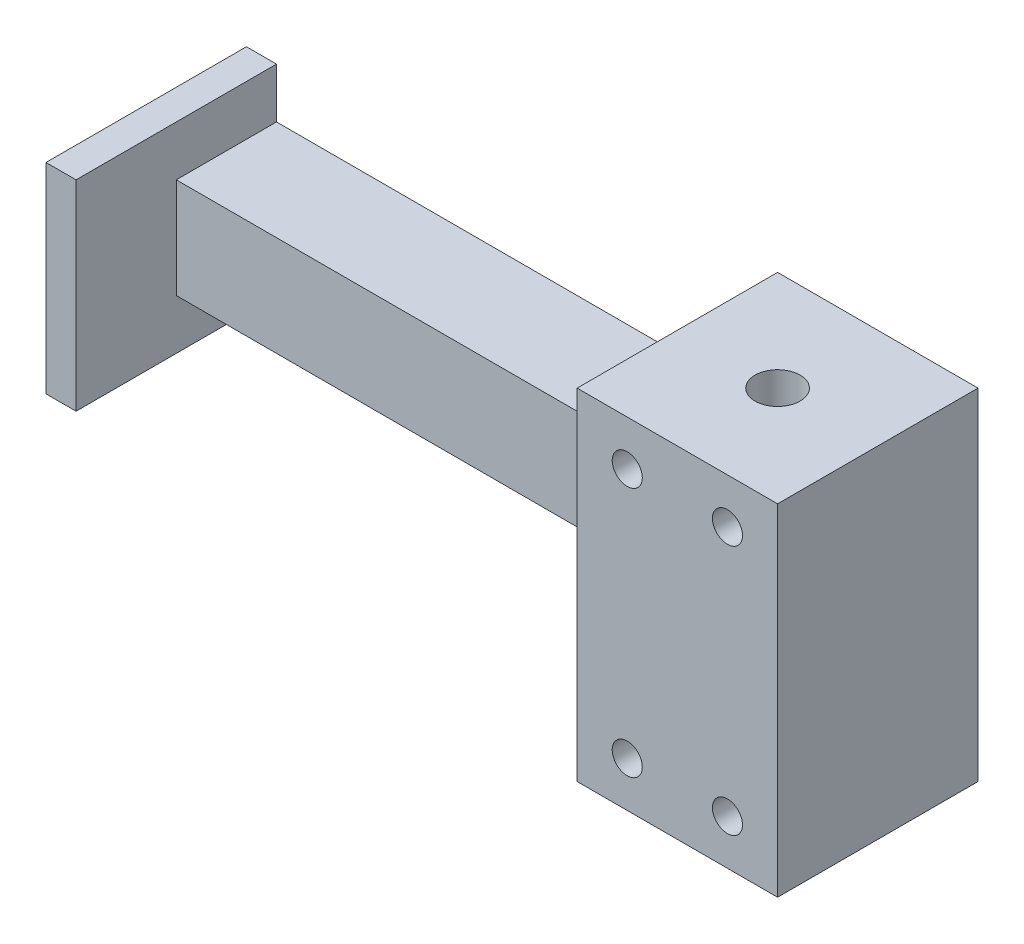
ISO-10303-21;
HEADER;
FILE_DESCRIPTION(('STEP AP214'),'2;1');
FILE_NAME('part.step','',(''),(''),'','','');
FILE_SCHEMA(('AUTOMOTIVE_DESIGN { 1 0 10303 214 1 1 1 1 }'));
ENDSEC;
DATA;
#1=APPLICATION_CONTEXT('core data for automotive mechanical design processes');
#2=APPLICATION_PROTOCOL_DEFINITION('international standard','automotive_design',2000,#1);
#3=PRODUCT_CONTEXT('',#1,'mechanical');
#4=PRODUCT('Part','Part','',(#3));
#5=PRODUCT_RELATED_PRODUCT_CATEGORY('part','',(#4));
#6=PRODUCT_DEFINITION_FORMATION('','',#4);
#7=PRODUCT_DEFINITION_CONTEXT('part definition',#1,'design');
#8=PRODUCT_DEFINITION('design','',#6,#7);
#9=PRODUCT_DEFINITION_SHAPE('','',#8);
#10=(LENGTH_UNIT() NAMED_UNIT(*) SI_UNIT(.MILLI.,.METRE.));
#11=(NAMED_UNIT(*) PLANE_ANGLE_UNIT() SI_UNIT($,.RADIAN.));
#12=(NAMED_UNIT(*) SI_UNIT($,.STERADIAN.) SOLID_ANGLE_UNIT());
#13=UNCERTAINTY_MEASURE_WITH_UNIT(LENGTH_MEASURE(1.E-05),#10,'distance_accuracy_value','');
#14=(GEOMETRIC_REPRESENTATION_CONTEXT(3) GLOBAL_UNCERTAINTY_ASSIGNED_CONTEXT((#13)) GLOBAL_UNIT_ASSIGNED_CONTEXT((#10,
#11,#12)) REPRESENTATION_CONTEXT('',''));
#15=CARTESIAN_POINT('',(0.,0.,0.));
#16=DIRECTION('',(0.,0.,1.));
#17=DIRECTION('',(1.,0.,0.));
#18=AXIS2_PLACEMENT_3D('',#15,#16,#17);
#19=CARTESIAN_POINT('',(0.,17.,20.));
#20=DIRECTION('',(1.,0.,0.));
#21=DIRECTION('',(0.,0.,-1.));
#22=AXIS2_PLACEMENT_3D('',#19,#20,#21);
#23=PLANE('',#22);
#24=DIRECTION('',(0.,0.,1.));
#25=VECTOR('',#24,1.);
#26=CARTESIAN_POINT('',(0.,-5.,10.));
#27=LINE('',#26,#25);
#28=CARTESIAN_POINT('',(0.,-5.,0.));
#29=VERTEX_POINT('',#28);
#30=CARTESIAN_POINT('',(0.,-5.,10.));
#31=VERTEX_POINT('',#30);
#32=EDGE_CURVE('E156',#29,#31,#27,.T.);
#33=ORIENTED_EDGE('',*,*,#32,.F.);
#34=DIRECTION('',(0.,-1.,0.));
#35=VECTOR('',#34,1.);
#36=CARTESIAN_POINT('',(0.,17.,0.));
#37=LINE('',#36,#35);
#38=CARTESIAN_POINT('',(0.,-17.,0.));
#39=VERTEX_POINT('',#38);
#40=EDGE_CURVE('E203',#29,#39,#37,.T.);
#41=ORIENTED_EDGE('',*,*,#40,.T.);
#42=DIRECTION('',(0.,0.,-1.));
#43=VECTOR('',#42,1.);
#44=CARTESIAN_POINT('',(0.,-17.,20.));
#45=LINE('',#44,#43);
#46=CARTESIAN_POINT('',(0.,-17.,20.));
#47=VERTEX_POINT('',#46);
#48=EDGE_CURVE('E11',#47,#39,#45,.T.);
#49=ORIENTED_EDGE('',*,*,#48,.F.);
#50=DIRECTION('',(0.,-1.,0.));
#51=VECTOR('',#50,1.);
#52=CARTESIAN_POINT('',(0.,17.,20.));
#53=LINE('',#52,#51);
#54=CARTESIAN_POINT('',(0.,17.,20.));
#55=VERTEX_POINT('',#54);
#56=EDGE_CURVE('E206',#55,#47,#53,.T.);
#57=ORIENTED_EDGE('',*,*,#56,.F.);
#58=DIRECTION('',(0.,0.,-1.));
#59=VECTOR('',#58,1.);
#60=CARTESIAN_POINT('',(0.,17.,20.));
#61=LINE('',#60,#59);
#62=CARTESIAN_POINT('',(0.,17.,0.));
#63=VERTEX_POINT('',#62);
#64=EDGE_CURVE('E216',#55,#63,#61,.T.);
#65=ORIENTED_EDGE('',*,*,#64,.T.);
#66=CARTESIAN_POINT('',(0.,5.,0.));
#67=VERTEX_POINT('',#66);
#68=EDGE_CURVE('E217',#63,#67,#37,.T.);
#69=ORIENTED_EDGE('',*,*,#68,.T.);
#70=DIRECTION('',(0.,0.,-1.));
#71=VECTOR('',#70,1.);
#72=CARTESIAN_POINT('',(0.,5.00000000000001,10.));
#73=LINE('',#72,#71);
#74=CARTESIAN_POINT('',(0.,5.00000000000001,10.));
#75=VERTEX_POINT('',#74);
#76=EDGE_CURVE('E51',#75,#67,#73,.T.);
#77=ORIENTED_EDGE('',*,*,#76,.F.);
#78=DIRECTION('',(0.,1.,0.));
#79=VECTOR('',#78,1.);
#80=CARTESIAN_POINT('',(0.,5.00000000000001,10.));
#81=LINE('',#80,#79);
#82=EDGE_CURVE('E46',#31,#75,#81,.T.);
#83=ORIENTED_EDGE('',*,*,#82,.F.);
#84=EDGE_LOOP('',(#33,#41,#49,#57,#65,#69,#77,#83));
#85=FACE_BOUND('',#84,.T.);
#86=ADVANCED_FACE('F32',(#85),#23,.F.);
#87=CARTESIAN_POINT('',(0.,0.,20.));
#88=DIRECTION('',(0.,0.,1.));
#89=DIRECTION('',(1.,0.,0.));
#90=AXIS2_PLACEMENT_3D('',#87,#88,#89);
#91=PLANE('',#90);
#92=CARTESIAN_POINT('',(5.,-12.5,20.));
#93=DIRECTION('',(0.,0.,1.));
#94=DIRECTION('',(1.,0.,0.));
#95=AXIS2_PLACEMENT_3D('',#92,#93,#94);
#96=CIRCLE('',#95,1.5);
#97=CARTESIAN_POINT('',(6.5,-12.5,20.));
#98=VERTEX_POINT('',#97);
#99=EDGE_CURVE('E188',#98,#98,#96,.T.);
#100=ORIENTED_EDGE('',*,*,#99,.F.);
#101=EDGE_LOOP('',(#100));
#102=FACE_BOUND('',#101,.T.);
#103=CARTESIAN_POINT('',(5.,12.5,20.));
#104=DIRECTION('',(0.,0.,1.));
#105=DIRECTION('',(1.,0.,0.));
#106=AXIS2_PLACEMENT_3D('',#103,#104,#105);
#107=CIRCLE('',#106,1.5);
#108=CARTESIAN_POINT('',(6.5,12.5,20.));
#109=VERTEX_POINT('',#108);
#110=EDGE_CURVE('E200',#109,#109,#107,.T.);
#111=ORIENTED_EDGE('',*,*,#110,.F.);
#112=EDGE_LOOP('',(#111));
#113=FACE_BOUND('',#112,.T.);
#114=ORIENTED_EDGE('',*,*,#56,.T.);
#115=DIRECTION('',(1.,0.,0.));
#116=VECTOR('',#115,1.);
#117=CARTESIAN_POINT('',(0.,-17.,20.));
#118=LINE('',#117,#116);
#119=CARTESIAN_POINT('',(20.,-17.,20.));
#120=VERTEX_POINT('',#119);
#121=EDGE_CURVE('E209',#47,#120,#118,.T.);
#122=ORIENTED_EDGE('',*,*,#121,.T.);
#123=DIRECTION('',(0.,1.,0.));
#124=VECTOR('',#123,1.);
#125=CARTESIAN_POINT('',(20.,17.,20.));
#126=LINE('',#125,#124);
#127=CARTESIAN_POINT('',(20.,17.,20.));
#128=VERTEX_POINT('',#127);
#129=EDGE_CURVE('E212',#120,#128,#126,.T.);
#130=ORIENTED_EDGE('',*,*,#129,.T.);
#131=DIRECTION('',(-1.,0.,0.));
#132=VECTOR('',#131,1.);
#133=CARTESIAN_POINT('',(0.,17.,20.));
#134=LINE('',#133,#132);
#135=EDGE_CURVE('E214',#128,#55,#134,.T.);
#136=ORIENTED_EDGE('',*,*,#135,.T.);
#137=EDGE_LOOP('',(#114,#122,#130,#136));
#138=FACE_BOUND('',#137,.T.);
#139=CARTESIAN_POINT('',(15.,12.5,20.));
#140=DIRECTION('',(0.,0.,1.));
#141=DIRECTION('',(1.,0.,0.));
#142=AXIS2_PLACEMENT_3D('',#139,#140,#141);
#143=CIRCLE('',#142,1.5);
#144=CARTESIAN_POINT('',(16.5,12.5,20.));
#145=VERTEX_POINT('',#144);
#146=EDGE_CURVE('E194',#145,#145,#143,.T.);
#147=ORIENTED_EDGE('',*,*,#146,.F.);
#148=EDGE_LOOP('',(#147));
#149=FACE_BOUND('',#148,.T.);
#150=CARTESIAN_POINT('',(15.,-12.5,20.));
#151=DIRECTION('',(0.,0.,1.));
#152=DIRECTION('',(1.,0.,0.));
#153=AXIS2_PLACEMENT_3D('',#150,#151,#152);
#154=CIRCLE('',#153,1.5);
#155=CARTESIAN_POINT('',(16.5,-12.5,20.));
#156=VERTEX_POINT('',#155);
#157=EDGE_CURVE('E182',#156,#156,#154,.T.);
#158=ORIENTED_EDGE('',*,*,#157,.F.);
#159=EDGE_LOOP('',(#158));
#160=FACE_BOUND('',#159,.T.);
#161=ADVANCED_FACE('F246',(#102,#113,#138,#149,#160),#91,.T.);
#162=CARTESIAN_POINT('',(0.,0.,0.));
#163=DIRECTION('',(0.,0.,1.));
#164=DIRECTION('',(1.,0.,0.));
#165=AXIS2_PLACEMENT_3D('',#162,#163,#164);
#166=PLANE('',#165);
#167=ORIENTED_EDGE('',*,*,#68,.F.);
#168=DIRECTION('',(-1.,0.,0.));
#169=VECTOR('',#168,1.);
#170=CARTESIAN_POINT('',(0.,17.,0.));
#171=LINE('',#170,#169);
#172=CARTESIAN_POINT('',(20.,17.,0.));
#173=VERTEX_POINT('',#172);
#174=EDGE_CURVE('E210',#173,#63,#171,.T.);
#175=ORIENTED_EDGE('',*,*,#174,.F.);
#176=DIRECTION('',(0.,1.,0.));
#177=VECTOR('',#176,1.);
#178=CARTESIAN_POINT('',(20.,17.,0.));
#179=LINE('',#178,#177);
#180=CARTESIAN_POINT('',(20.,-17.,0.));
#181=VERTEX_POINT('',#180);
#182=EDGE_CURVE('E221',#181,#173,#179,.T.);
#183=ORIENTED_EDGE('',*,*,#182,.F.);
#184=DIRECTION('',(1.,0.,0.));
#185=VECTOR('',#184,1.);
#186=CARTESIAN_POINT('',(0.,-17.,0.));
#187=LINE('',#186,#185);
#188=EDGE_CURVE('E219',#39,#181,#187,.T.);
#189=ORIENTED_EDGE('',*,*,#188,.F.);
#190=ORIENTED_EDGE('',*,*,#40,.F.);
#191=DIRECTION('',(1.,0.,0.));
#192=VECTOR('',#191,1.);
#193=CARTESIAN_POINT('',(-50.,-5.,0.));
#194=LINE('',#193,#192);
#195=CARTESIAN_POINT('',(-50.,-5.,0.));
#196=VERTEX_POINT('',#195);
#197=EDGE_CURVE('E167',#196,#29,#194,.T.);
#198=ORIENTED_EDGE('',*,*,#197,.F.);
#199=DIRECTION('',(0.,-1.,0.));
#200=VECTOR('',#199,1.);
#201=CARTESIAN_POINT('',(-50.,10.,0.));
#202=LINE('',#201,#200);
#203=CARTESIAN_POINT('',(-50.,-10.,0.));
#204=VERTEX_POINT('',#203);
#205=EDGE_CURVE('E144',#196,#204,#202,.T.);
#206=ORIENTED_EDGE('',*,*,#205,.T.);
#207=DIRECTION('',(1.,0.,0.));
#208=VECTOR('',#207,1.);
#209=CARTESIAN_POINT('',(-53.,-10.,0.));
#210=LINE('',#209,#208);
#211=CARTESIAN_POINT('',(-53.,-10.,0.));
#212=VERTEX_POINT('',#211);
#213=EDGE_CURVE('E123',#212,#204,#210,.T.);
#214=ORIENTED_EDGE('',*,*,#213,.F.);
#215=DIRECTION('',(0.,-1.,0.));
#216=VECTOR('',#215,1.);
#217=CARTESIAN_POINT('',(-53.,10.,0.));
#218=LINE('',#217,#216);
#219=CARTESIAN_POINT('',(-53.,10.,0.));
#220=VERTEX_POINT('',#219);
#221=EDGE_CURVE('E129',#220,#212,#218,.T.);
#222=ORIENTED_EDGE('',*,*,#221,.F.);
#223=DIRECTION('',(1.,0.,0.));
#224=VECTOR('',#223,1.);
#225=CARTESIAN_POINT('',(-53.,10.,0.));
#226=LINE('',#225,#224);
#227=CARTESIAN_POINT('',(-50.,10.,0.));
#228=VERTEX_POINT('',#227);
#229=EDGE_CURVE('E429',#220,#228,#226,.T.);
#230=ORIENTED_EDGE('',*,*,#229,.T.);
#231=CARTESIAN_POINT('',(-50.,5.,0.));
#232=VERTEX_POINT('',#231);
#233=EDGE_CURVE('E436',#228,#232,#202,.T.);
#234=ORIENTED_EDGE('',*,*,#233,.T.);
#235=DIRECTION('',(1.,0.,0.));
#236=VECTOR('',#235,1.);
#237=CARTESIAN_POINT('',(-50.,5.,0.));
#238=LINE('',#237,#236);
#239=EDGE_CURVE('E170',#232,#67,#238,.T.);
#240=ORIENTED_EDGE('',*,*,#239,.T.);
#241=EDGE_LOOP('',(#167,#175,#183,#189,#190,#198,#206,#214,#222,#230,#234,#240));
#242=FACE_BOUND('',#241,.T.);
#243=CARTESIAN_POINT('',(5.,12.5,0.));
#244=DIRECTION('',(0.,0.,1.));
#245=DIRECTION('',(1.,0.,0.));
#246=AXIS2_PLACEMENT_3D('',#243,#244,#245);
#247=CIRCLE('',#246,1.5);
#248=CARTESIAN_POINT('',(6.5,12.5,0.));
#249=VERTEX_POINT('',#248);
#250=EDGE_CURVE('E197',#249,#249,#247,.T.);
#251=ORIENTED_EDGE('',*,*,#250,.T.);
#252=EDGE_LOOP('',(#251));
#253=FACE_BOUND('',#252,.T.);
#254=CARTESIAN_POINT('',(15.,12.5,0.));
#255=DIRECTION('',(0.,0.,1.));
#256=DIRECTION('',(1.,0.,0.));
#257=AXIS2_PLACEMENT_3D('',#254,#255,#256);
#258=CIRCLE('',#257,1.5);
#259=CARTESIAN_POINT('',(16.5,12.5,0.));
#260=VERTEX_POINT('',#259);
#261=EDGE_CURVE('E191',#260,#260,#258,.T.);
#262=ORIENTED_EDGE('',*,*,#261,.T.);
#263=EDGE_LOOP('',(#262));
#264=FACE_BOUND('',#263,.T.);
#265=CARTESIAN_POINT('',(5.,-12.5,0.));
#266=DIRECTION('',(0.,0.,1.));
#267=DIRECTION('',(1.,0.,0.));
#268=AXIS2_PLACEMENT_3D('',#265,#266,#267);
#269=CIRCLE('',#268,1.5);
#270=CARTESIAN_POINT('',(6.5,-12.5,0.));
#271=VERTEX_POINT('',#270);
#272=EDGE_CURVE('E185',#271,#271,#269,.T.);
#273=ORIENTED_EDGE('',*,*,#272,.T.);
#274=EDGE_LOOP('',(#273));
#275=FACE_BOUND('',#274,.T.);
#276=CARTESIAN_POINT('',(15.,-12.5,0.));
#277=DIRECTION('',(0.,0.,1.));
#278=DIRECTION('',(1.,0.,0.));
#279=AXIS2_PLACEMENT_3D('',#276,#277,#278);
#280=CIRCLE('',#279,1.5);
#281=CARTESIAN_POINT('',(16.5,-12.5,0.));
#282=VERTEX_POINT('',#281);
#283=EDGE_CURVE('E179',#282,#282,#280,.T.);
#284=ORIENTED_EDGE('',*,*,#283,.T.);
#285=EDGE_LOOP('',(#284));
#286=FACE_BOUND('',#285,.T.);
#287=ADVANCED_FACE('F141',(#242,#253,#264,#275,#286),#166,.F.);
#288=CARTESIAN_POINT('',(0.,-17.,20.));
#289=DIRECTION('',(0.,1.,0.));
#290=DIRECTION('',(0.,0.,1.));
#291=AXIS2_PLACEMENT_3D('',#288,#289,#290);
#292=PLANE('',#291);
#293=CARTESIAN_POINT('',(10.,-17.,10.));
#294=DIRECTION('',(0.,-1.,0.));
#295=DIRECTION('',(0.,0.,-1.));
#296=AXIS2_PLACEMENT_3D('',#293,#294,#295);
#297=CIRCLE('',#296,2.25);
#298=CARTESIAN_POINT('',(10.,-17.,7.75));
#299=VERTEX_POINT('',#298);
#300=EDGE_CURVE('E175',#299,#299,#297,.T.);
#301=ORIENTED_EDGE('',*,*,#300,.F.);
#302=EDGE_LOOP('',(#301));
#303=FACE_BOUND('',#302,.T.);
#304=ORIENTED_EDGE('',*,*,#188,.T.);
#305=DIRECTION('',(0.,0.,-1.));
#306=VECTOR('',#305,1.);
#307=CARTESIAN_POINT('',(20.,-17.,20.));
#308=LINE('',#307,#306);
#309=EDGE_CURVE('E39',#120,#181,#308,.T.);
#310=ORIENTED_EDGE('',*,*,#309,.F.);
#311=ORIENTED_EDGE('',*,*,#121,.F.);
#312=ORIENTED_EDGE('',*,*,#48,.T.);
#313=EDGE_LOOP('',(#304,#310,#311,#312));
#314=FACE_BOUND('',#313,.T.);
#315=ADVANCED_FACE('F248',(#303,#314),#292,.F.);
#316=CARTESIAN_POINT('',(20.,17.,20.));
#317=DIRECTION('',(-1.,0.,0.));
#318=DIRECTION('',(0.,0.,1.));
#319=AXIS2_PLACEMENT_3D('',#316,#317,#318);
#320=PLANE('',#319);
#321=ORIENTED_EDGE('',*,*,#182,.T.);
#322=DIRECTION('',(0.,0.,-1.));
#323=VECTOR('',#322,1.);
#324=CARTESIAN_POINT('',(20.,17.,20.));
#325=LINE('',#324,#323);
#326=EDGE_CURVE('E226',#128,#173,#325,.T.);
#327=ORIENTED_EDGE('',*,*,#326,.F.);
#328=ORIENTED_EDGE('',*,*,#129,.F.);
#329=ORIENTED_EDGE('',*,*,#309,.T.);
#330=EDGE_LOOP('',(#321,#327,#328,#329));
#331=FACE_BOUND('',#330,.T.);
#332=ADVANCED_FACE('F233',(#331),#320,.F.);
#333=CARTESIAN_POINT('',(0.,17.,20.));
#334=DIRECTION('',(0.,-1.,0.));
#335=DIRECTION('',(0.,0.,-1.));
#336=AXIS2_PLACEMENT_3D('',#333,#334,#335);
#337=PLANE('',#336);
#338=CARTESIAN_POINT('',(10.,17.,10.));
#339=DIRECTION('',(0.,-1.,0.));
#340=DIRECTION('',(0.,0.,-1.));
#341=AXIS2_PLACEMENT_3D('',#338,#339,#340);
#342=CIRCLE('',#341,2.25);
#343=CARTESIAN_POINT('',(10.,17.,7.75));
#344=VERTEX_POINT('',#343);
#345=EDGE_CURVE('E176',#344,#344,#342,.T.);
#346=ORIENTED_EDGE('',*,*,#345,.T.);
#347=EDGE_LOOP('',(#346));
#348=FACE_BOUND('',#347,.T.);
#349=ORIENTED_EDGE('',*,*,#174,.T.);
#350=ORIENTED_EDGE('',*,*,#64,.F.);
#351=ORIENTED_EDGE('',*,*,#135,.F.);
#352=ORIENTED_EDGE('',*,*,#326,.T.);
#353=EDGE_LOOP('',(#349,#350,#351,#352));
#354=FACE_BOUND('',#353,.T.);
#355=ADVANCED_FACE('F241',(#348,#354),#337,.F.);
#356=CARTESIAN_POINT('',(5.,12.5,20.));
#357=DIRECTION('',(0.,0.,-1.));
#358=DIRECTION('',(-1.,0.,0.));
#359=AXIS2_PLACEMENT_3D('',#356,#357,#358);
#360=CYLINDRICAL_SURFACE('',#359,1.5);
#361=ORIENTED_EDGE('',*,*,#110,.T.);
#362=EDGE_LOOP('',(#361));
#363=FACE_BOUND('',#362,.T.);
#364=ORIENTED_EDGE('',*,*,#250,.F.);
#365=EDGE_LOOP('',(#364));
#366=FACE_BOUND('',#365,.T.);
#367=ADVANCED_FACE('F269',(#363,#366),#360,.F.);
#368=CARTESIAN_POINT('',(15.,12.5,20.));
#369=DIRECTION('',(0.,0.,-1.));
#370=DIRECTION('',(-1.,0.,0.));
#371=AXIS2_PLACEMENT_3D('',#368,#369,#370);
#372=CYLINDRICAL_SURFACE('',#371,1.5);
#373=ORIENTED_EDGE('',*,*,#146,.T.);
#374=EDGE_LOOP('',(#373));
#375=FACE_BOUND('',#374,.T.);
#376=ORIENTED_EDGE('',*,*,#261,.F.);
#377=EDGE_LOOP('',(#376));
#378=FACE_BOUND('',#377,.T.);
#379=ADVANCED_FACE('F277',(#375,#378),#372,.F.);
#380=CARTESIAN_POINT('',(5.,-12.5,20.));
#381=DIRECTION('',(0.,0.,-1.));
#382=DIRECTION('',(-1.,0.,0.));
#383=AXIS2_PLACEMENT_3D('',#380,#381,#382);
#384=CYLINDRICAL_SURFACE('',#383,1.5);
#385=ORIENTED_EDGE('',*,*,#99,.T.);
#386=EDGE_LOOP('',(#385));
#387=FACE_BOUND('',#386,.T.);
#388=ORIENTED_EDGE('',*,*,#272,.F.);
#389=EDGE_LOOP('',(#388));
#390=FACE_BOUND('',#389,.T.);
#391=ADVANCED_FACE('F294',(#387,#390),#384,.F.);
#392=CARTESIAN_POINT('',(15.,-12.5,20.));
#393=DIRECTION('',(0.,0.,-1.));
#394=DIRECTION('',(-1.,0.,0.));
#395=AXIS2_PLACEMENT_3D('',#392,#393,#394);
#396=CYLINDRICAL_SURFACE('',#395,1.5);
#397=ORIENTED_EDGE('',*,*,#157,.T.);
#398=EDGE_LOOP('',(#397));
#399=FACE_BOUND('',#398,.T.);
#400=ORIENTED_EDGE('',*,*,#283,.F.);
#401=EDGE_LOOP('',(#400));
#402=FACE_BOUND('',#401,.T.);
#403=ADVANCED_FACE('F285',(#399,#402),#396,.F.);
#404=CARTESIAN_POINT('',(10.,17.,10.));
#405=DIRECTION('',(0.,-1.,0.));
#406=DIRECTION('',(0.,0.,-1.));
#407=AXIS2_PLACEMENT_3D('',#404,#405,#406);
#408=CYLINDRICAL_SURFACE('',#407,2.25);
#409=ORIENTED_EDGE('',*,*,#345,.F.);
#410=EDGE_LOOP('',(#409));
#411=FACE_BOUND('',#410,.T.);
#412=ORIENTED_EDGE('',*,*,#300,.T.);
#413=EDGE_LOOP('',(#412));
#414=FACE_BOUND('',#413,.T.);
#415=ADVANCED_FACE('F281',(#411,#414),#408,.F.);
#416=CARTESIAN_POINT('',(-50.,5.00000000000001,10.));
#417=DIRECTION('',(0.,0.,-1.));
#418=DIRECTION('',(0.,1.,0.));
#419=AXIS2_PLACEMENT_3D('',#416,#417,#418);
#420=PLANE('',#419);
#421=ORIENTED_EDGE('',*,*,#82,.T.);
#422=DIRECTION('',(1.,0.,0.));
#423=VECTOR('',#422,1.);
#424=CARTESIAN_POINT('',(-50.,5.00000000000001,10.));
#425=LINE('',#424,#423);
#426=CARTESIAN_POINT('',(-50.,5.00000000000001,10.));
#427=VERTEX_POINT('',#426);
#428=EDGE_CURVE('E173',#427,#75,#425,.T.);
#429=ORIENTED_EDGE('',*,*,#428,.F.);
#430=DIRECTION('',(0.,1.,0.));
#431=VECTOR('',#430,1.);
#432=CARTESIAN_POINT('',(-50.,5.00000000000001,10.));
#433=LINE('',#432,#431);
#434=CARTESIAN_POINT('',(-50.,-5.,10.));
#435=VERTEX_POINT('',#434);
#436=EDGE_CURVE('E152',#435,#427,#433,.T.);
#437=ORIENTED_EDGE('',*,*,#436,.F.);
#438=DIRECTION('',(1.,0.,0.));
#439=VECTOR('',#438,1.);
#440=CARTESIAN_POINT('',(-50.,-5.,10.));
#441=LINE('',#440,#439);
#442=EDGE_CURVE('E161',#435,#31,#441,.T.);
#443=ORIENTED_EDGE('',*,*,#442,.T.);
#444=EDGE_LOOP('',(#421,#429,#437,#443));
#445=FACE_BOUND('',#444,.T.);
#446=ADVANCED_FACE('F284',(#445),#420,.F.);
#447=CARTESIAN_POINT('',(-50.,5.00000000000001,10.));
#448=DIRECTION('',(0.,-1.,0.));
#449=DIRECTION('',(0.,0.,-1.));
#450=AXIS2_PLACEMENT_3D('',#447,#448,#449);
#451=PLANE('',#450);
#452=ORIENTED_EDGE('',*,*,#76,.T.);
#453=ORIENTED_EDGE('',*,*,#239,.F.);
#454=DIRECTION('',(0.,0.,-1.));
#455=VECTOR('',#454,1.);
#456=CARTESIAN_POINT('',(-50.,5.00000000000001,10.));
#457=LINE('',#456,#455);
#458=EDGE_CURVE('E155',#427,#232,#457,.T.);
#459=ORIENTED_EDGE('',*,*,#458,.F.);
#460=ORIENTED_EDGE('',*,*,#428,.T.);
#461=EDGE_LOOP('',(#452,#453,#459,#460));
#462=FACE_BOUND('',#461,.T.);
#463=ADVANCED_FACE('F291',(#462),#451,.F.);
#464=CARTESIAN_POINT('',(-50.,-5.,10.));
#465=DIRECTION('',(0.,1.,0.));
#466=DIRECTION('',(0.,0.,1.));
#467=AXIS2_PLACEMENT_3D('',#464,#465,#466);
#468=PLANE('',#467);
#469=ORIENTED_EDGE('',*,*,#32,.T.);
#470=ORIENTED_EDGE('',*,*,#442,.F.);
#471=DIRECTION('',(0.,0.,1.));
#472=VECTOR('',#471,1.);
#473=CARTESIAN_POINT('',(-50.,-5.,10.));
#474=LINE('',#473,#472);
#475=EDGE_CURVE('E159',#196,#435,#474,.T.);
#476=ORIENTED_EDGE('',*,*,#475,.F.);
#477=ORIENTED_EDGE('',*,*,#197,.T.);
#478=EDGE_LOOP('',(#469,#470,#476,#477));
#479=FACE_BOUND('',#478,.T.);
#480=ADVANCED_FACE('F370',(#479),#468,.F.);
#481=CARTESIAN_POINT('',(-50.,0.,0.));
#482=DIRECTION('',(-1.,0.,0.));
#483=DIRECTION('',(0.,0.,1.));
#484=AXIS2_PLACEMENT_3D('',#481,#482,#483);
#485=PLANE('',#484);
#486=ORIENTED_EDGE('',*,*,#436,.T.);
#487=ORIENTED_EDGE('',*,*,#458,.T.);
#488=ORIENTED_EDGE('',*,*,#233,.F.);
#489=DIRECTION('',(0.,0.,-1.));
#490=VECTOR('',#489,1.);
#491=CARTESIAN_POINT('',(-50.,10.,0.));
#492=LINE('',#491,#490);
#493=CARTESIAN_POINT('',(-50.,10.,20.));
#494=VERTEX_POINT('',#493);
#495=EDGE_CURVE('E138',#494,#228,#492,.T.);
#496=ORIENTED_EDGE('',*,*,#495,.F.);
#497=DIRECTION('',(0.,1.,0.));
#498=VECTOR('',#497,1.);
#499=CARTESIAN_POINT('',(-50.,10.,20.));
#500=LINE('',#499,#498);
#501=CARTESIAN_POINT('',(-50.,-10.,20.));
#502=VERTEX_POINT('',#501);
#503=EDGE_CURVE('E433',#502,#494,#500,.T.);
#504=ORIENTED_EDGE('',*,*,#503,.F.);
#505=DIRECTION('',(0.,0.,1.));
#506=VECTOR('',#505,1.);
#507=CARTESIAN_POINT('',(-50.,-10.,0.));
#508=LINE('',#507,#506);
#509=EDGE_CURVE('E438',#204,#502,#508,.T.);
#510=ORIENTED_EDGE('',*,*,#509,.F.);
#511=ORIENTED_EDGE('',*,*,#205,.F.);
#512=ORIENTED_EDGE('',*,*,#475,.T.);
#513=EDGE_LOOP('',(#486,#487,#488,#496,#504,#510,#511,#512));
#514=FACE_BOUND('',#513,.T.);
#515=ADVANCED_FACE('F378',(#514),#485,.F.);
#516=CARTESIAN_POINT('',(-53.,-10.,0.));
#517=DIRECTION('',(0.,1.,0.));
#518=DIRECTION('',(0.,0.,1.));
#519=AXIS2_PLACEMENT_3D('',#516,#517,#518);
#520=PLANE('',#519);
#521=ORIENTED_EDGE('',*,*,#509,.T.);
#522=DIRECTION('',(1.,0.,0.));
#523=VECTOR('',#522,1.);
#524=CARTESIAN_POINT('',(-53.,-10.,20.));
#525=LINE('',#524,#523);
#526=CARTESIAN_POINT('',(-53.,-10.,20.));
#527=VERTEX_POINT('',#526);
#528=EDGE_CURVE('E125',#527,#502,#525,.T.);
#529=ORIENTED_EDGE('',*,*,#528,.F.);
#530=DIRECTION('',(0.,0.,1.));
#531=VECTOR('',#530,1.);
#532=CARTESIAN_POINT('',(-53.,-10.,0.));
#533=LINE('',#532,#531);
#534=EDGE_CURVE('E119',#212,#527,#533,.T.);
#535=ORIENTED_EDGE('',*,*,#534,.F.);
#536=ORIENTED_EDGE('',*,*,#213,.T.);
#537=EDGE_LOOP('',(#521,#529,#535,#536));
#538=FACE_BOUND('',#537,.T.);
#539=ADVANCED_FACE('F121',(#538),#520,.F.);
#540=CARTESIAN_POINT('',(-53.,10.,20.));
#541=DIRECTION('',(0.,0.,-1.));
#542=DIRECTION('',(-1.,0.,0.));
#543=AXIS2_PLACEMENT_3D('',#540,#541,#542);
#544=PLANE('',#543);
#545=ORIENTED_EDGE('',*,*,#503,.T.);
#546=DIRECTION('',(1.,0.,0.));
#547=VECTOR('',#546,1.);
#548=CARTESIAN_POINT('',(-53.,10.,20.));
#549=LINE('',#548,#547);
#550=CARTESIAN_POINT('',(-53.,10.,20.));
#551=VERTEX_POINT('',#550);
#552=EDGE_CURVE('E148',#551,#494,#549,.T.);
#553=ORIENTED_EDGE('',*,*,#552,.F.);
#554=DIRECTION('',(0.,1.,0.));
#555=VECTOR('',#554,1.);
#556=CARTESIAN_POINT('',(-53.,10.,20.));
#557=LINE('',#556,#555);
#558=EDGE_CURVE('E128',#527,#551,#557,.T.);
#559=ORIENTED_EDGE('',*,*,#558,.F.);
#560=ORIENTED_EDGE('',*,*,#528,.T.);
#561=EDGE_LOOP('',(#545,#553,#559,#560));
#562=FACE_BOUND('',#561,.T.);
#563=ADVANCED_FACE('F396',(#562),#544,.F.);
#564=CARTESIAN_POINT('',(-53.,10.,0.));
#565=DIRECTION('',(0.,-1.,0.));
#566=DIRECTION('',(0.,0.,-1.));
#567=AXIS2_PLACEMENT_3D('',#564,#565,#566);
#568=PLANE('',#567);
#569=ORIENTED_EDGE('',*,*,#495,.T.);
#570=ORIENTED_EDGE('',*,*,#229,.F.);
#571=DIRECTION('',(0.,0.,-1.));
#572=VECTOR('',#571,1.);
#573=CARTESIAN_POINT('',(-53.,10.,0.));
#574=LINE('',#573,#572);
#575=EDGE_CURVE('E134',#551,#220,#574,.T.);
#576=ORIENTED_EDGE('',*,*,#575,.F.);
#577=ORIENTED_EDGE('',*,*,#552,.T.);
#578=EDGE_LOOP('',(#569,#570,#576,#577));
#579=FACE_BOUND('',#578,.T.);
#580=ADVANCED_FACE('F405',(#579),#568,.F.);
#581=CARTESIAN_POINT('',(-53.,0.,0.));
#582=DIRECTION('',(-1.,0.,0.));
#583=DIRECTION('',(0.,0.,1.));
#584=AXIS2_PLACEMENT_3D('',#581,#582,#583);
#585=PLANE('',#584);
#586=ORIENTED_EDGE('',*,*,#221,.T.);
#587=ORIENTED_EDGE('',*,*,#534,.T.);
#588=ORIENTED_EDGE('',*,*,#558,.T.);
#589=ORIENTED_EDGE('',*,*,#575,.T.);
#590=EDGE_LOOP('',(#586,#587,#588,#589));
#591=FACE_BOUND('',#590,.T.);
#592=ADVANCED_FACE('F132',(#591),#585,.T.);
#593=CLOSED_SHELL('',(#86,#161,#287,#315,#332,#355,#367,#379,#391,#403,#415,#446,#463,#480,#515,
#539,#563,#580,#592));
#594=MANIFOLD_SOLID_BREP('B2',#593);
#595=ADVANCED_BREP_SHAPE_REPRESENTATION('',(#18,#594),#14);
#596=SHAPE_DEFINITION_REPRESENTATION(#9,#595);
ENDSEC;
END-ISO-10303-21;
